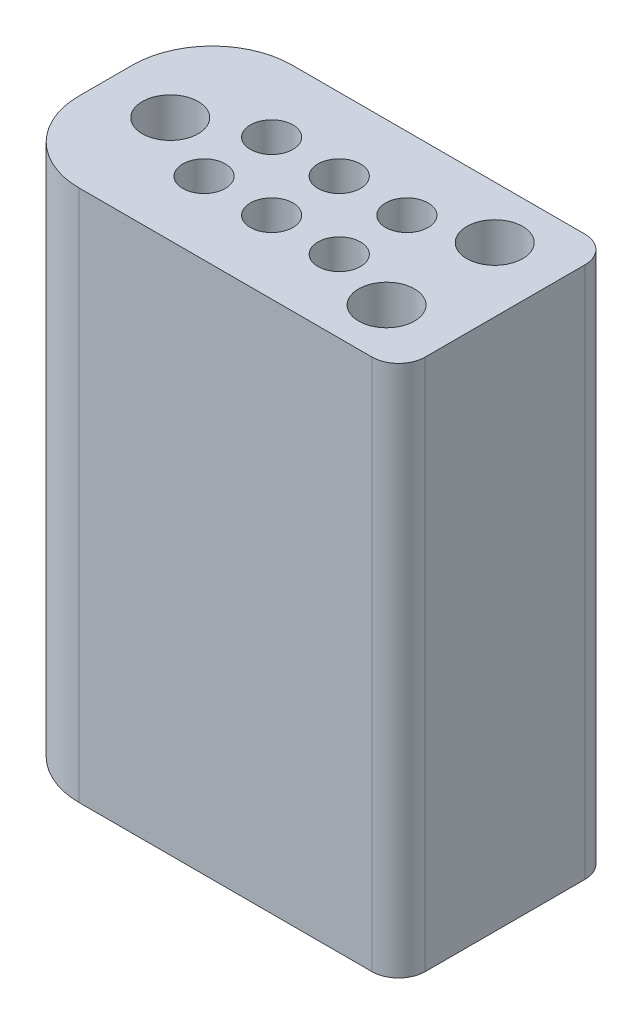
ISO-10303-21;
HEADER;
FILE_DESCRIPTION(('STEP AP214'),'2;1');
FILE_NAME('part.step','',(''),(''),'','','');
FILE_SCHEMA(('AUTOMOTIVE_DESIGN { 1 0 10303 214 1 1 1 1 }'));
ENDSEC;
DATA;
#1=APPLICATION_CONTEXT('core data for automotive mechanical design processes');
#2=APPLICATION_PROTOCOL_DEFINITION('international standard','automotive_design',2000,#1);
#3=PRODUCT_CONTEXT('',#1,'mechanical');
#4=PRODUCT('Part','Part','',(#3));
#5=PRODUCT_RELATED_PRODUCT_CATEGORY('part','',(#4));
#6=PRODUCT_DEFINITION_FORMATION('','',#4);
#7=PRODUCT_DEFINITION_CONTEXT('part definition',#1,'design');
#8=PRODUCT_DEFINITION('design','',#6,#7);
#9=PRODUCT_DEFINITION_SHAPE('','',#8);
#10=(LENGTH_UNIT() NAMED_UNIT(*) SI_UNIT(.MILLI.,.METRE.));
#11=(NAMED_UNIT(*) PLANE_ANGLE_UNIT() SI_UNIT($,.RADIAN.));
#12=(NAMED_UNIT(*) SI_UNIT($,.STERADIAN.) SOLID_ANGLE_UNIT());
#13=UNCERTAINTY_MEASURE_WITH_UNIT(LENGTH_MEASURE(1.E-05),#10,'distance_accuracy_value','');
#14=(GEOMETRIC_REPRESENTATION_CONTEXT(3) GLOBAL_UNCERTAINTY_ASSIGNED_CONTEXT((#13)) GLOBAL_UNIT_ASSIGNED_CONTEXT((#10,
#11,#12)) REPRESENTATION_CONTEXT('',''));
#15=CARTESIAN_POINT('',(0.,0.,0.));
#16=DIRECTION('',(0.,0.,1.));
#17=DIRECTION('',(1.,0.,0.));
#18=AXIS2_PLACEMENT_3D('',#15,#16,#17);
#19=CARTESIAN_POINT('',(-2.25,10.,0.5));
#20=DIRECTION('',(0.,1.,0.));
#21=DIRECTION('',(0.,0.,1.));
#22=AXIS2_PLACEMENT_3D('',#19,#20,#21);
#23=PLANE('',#22);
#24=CARTESIAN_POINT('',(2.54,10.,1.016));
#25=DIRECTION('',(0.,1.,0.));
#26=DIRECTION('',(0.,0.,1.));
#27=AXIS2_PLACEMENT_3D('',#24,#25,#26);
#28=CIRCLE('',#27,0.525);
#29=CARTESIAN_POINT('',(2.54,10.,1.541));
#30=VERTEX_POINT('',#29);
#31=EDGE_CURVE('E218',#30,#30,#28,.T.);
#32=ORIENTED_EDGE('',*,*,#31,.F.);
#33=EDGE_LOOP('',(#32));
#34=FACE_BOUND('',#33,.T.);
#35=CARTESIAN_POINT('',(1.27,10.,0.635));
#36=DIRECTION('',(0.,1.,0.));
#37=DIRECTION('',(0.,0.,1.));
#38=AXIS2_PLACEMENT_3D('',#35,#36,#37);
#39=CIRCLE('',#38,0.4);
#40=CARTESIAN_POINT('',(1.27,10.,1.035));
#41=VERTEX_POINT('',#40);
#42=EDGE_CURVE('E206',#41,#41,#39,.T.);
#43=ORIENTED_EDGE('',*,*,#42,.F.);
#44=EDGE_LOOP('',(#43));
#45=FACE_BOUND('',#44,.T.);
#46=CARTESIAN_POINT('',(-1.27,10.,-0.635));
#47=DIRECTION('',(0.,1.,0.));
#48=DIRECTION('',(0.,0.,1.));
#49=AXIS2_PLACEMENT_3D('',#46,#47,#48);
#50=CIRCLE('',#49,0.4);
#51=CARTESIAN_POINT('',(-1.27,10.,-0.235));
#52=VERTEX_POINT('',#51);
#53=EDGE_CURVE('E194',#52,#52,#50,.T.);
#54=ORIENTED_EDGE('',*,*,#53,.F.);
#55=EDGE_LOOP('',(#54));
#56=FACE_BOUND('',#55,.T.);
#57=CARTESIAN_POINT('',(0.,10.,0.635));
#58=DIRECTION('',(0.,1.,0.));
#59=DIRECTION('',(0.,0.,1.));
#60=AXIS2_PLACEMENT_3D('',#57,#58,#59);
#61=CIRCLE('',#60,0.4);
#62=CARTESIAN_POINT('',(0.,10.,1.035));
#63=VERTEX_POINT('',#62);
#64=EDGE_CURVE('E182',#63,#63,#61,.T.);
#65=ORIENTED_EDGE('',*,*,#64,.F.);
#66=EDGE_LOOP('',(#65));
#67=FACE_BOUND('',#66,.T.);
#68=CARTESIAN_POINT('',(-2.25,10.,0.5));
#69=DIRECTION('',(0.,1.,0.));
#70=DIRECTION('',(0.,0.,1.));
#71=AXIS2_PLACEMENT_3D('',#68,#69,#70);
#72=CIRCLE('',#71,1.5);
#73=CARTESIAN_POINT('',(-3.75,10.,0.5));
#74=VERTEX_POINT('',#73);
#75=CARTESIAN_POINT('',(-2.25,10.,2.));
#76=VERTEX_POINT('',#75);
#77=EDGE_CURVE('E145',#74,#76,#72,.T.);
#78=ORIENTED_EDGE('',*,*,#77,.T.);
#79=DIRECTION('',(1.,0.,0.));
#80=VECTOR('',#79,1.);
#81=CARTESIAN_POINT('',(-2.25,10.,2.));
#82=LINE('',#81,#80);
#83=CARTESIAN_POINT('',(3.25,10.,2.));
#84=VERTEX_POINT('',#83);
#85=EDGE_CURVE('E93',#76,#84,#82,.T.);
#86=ORIENTED_EDGE('',*,*,#85,.T.);
#87=CARTESIAN_POINT('',(3.25,10.,1.5));
#88=DIRECTION('',(0.,1.,0.));
#89=DIRECTION('',(0.,0.,1.));
#90=AXIS2_PLACEMENT_3D('',#87,#88,#89);
#91=CIRCLE('',#90,0.5);
#92=CARTESIAN_POINT('',(3.75,10.,1.5));
#93=VERTEX_POINT('',#92);
#94=EDGE_CURVE('E160',#84,#93,#91,.T.);
#95=ORIENTED_EDGE('',*,*,#94,.T.);
#96=DIRECTION('',(0.,0.,-1.));
#97=VECTOR('',#96,1.);
#98=CARTESIAN_POINT('',(3.75,10.,-1.5));
#99=LINE('',#98,#97);
#100=CARTESIAN_POINT('',(3.75,10.,-1.5));
#101=VERTEX_POINT('',#100);
#102=EDGE_CURVE('E173',#93,#101,#99,.T.);
#103=ORIENTED_EDGE('',*,*,#102,.T.);
#104=CARTESIAN_POINT('',(3.25,10.,-1.5));
#105=DIRECTION('',(0.,1.,0.));
#106=DIRECTION('',(0.,0.,-1.));
#107=AXIS2_PLACEMENT_3D('',#104,#105,#106);
#108=CIRCLE('',#107,0.5);
#109=CARTESIAN_POINT('',(3.25,10.,-2.));
#110=VERTEX_POINT('',#109);
#111=EDGE_CURVE('E112',#101,#110,#108,.T.);
#112=ORIENTED_EDGE('',*,*,#111,.T.);
#113=DIRECTION('',(-1.,0.,0.));
#114=VECTOR('',#113,1.);
#115=CARTESIAN_POINT('',(-2.25,10.,-2.));
#116=LINE('',#115,#114);
#117=CARTESIAN_POINT('',(-2.25,10.,-2.));
#118=VERTEX_POINT('',#117);
#119=EDGE_CURVE('E106',#110,#118,#116,.T.);
#120=ORIENTED_EDGE('',*,*,#119,.T.);
#121=CARTESIAN_POINT('',(-2.25,10.,-0.5));
#122=DIRECTION('',(0.,1.,0.));
#123=DIRECTION('',(0.,0.,1.));
#124=AXIS2_PLACEMENT_3D('',#121,#122,#123);
#125=CIRCLE('',#124,1.5);
#126=CARTESIAN_POINT('',(-3.75,10.,-0.5));
#127=VERTEX_POINT('',#126);
#128=EDGE_CURVE('E110',#118,#127,#125,.T.);
#129=ORIENTED_EDGE('',*,*,#128,.T.);
#130=DIRECTION('',(0.,0.,1.));
#131=VECTOR('',#130,1.);
#132=CARTESIAN_POINT('',(-3.75,10.,-0.5));
#133=LINE('',#132,#131);
#134=EDGE_CURVE('E50',#127,#74,#133,.T.);
#135=ORIENTED_EDGE('',*,*,#134,.T.);
#136=EDGE_LOOP('',(#78,#86,#95,#103,#112,#120,#129,#135));
#137=FACE_BOUND('',#136,.T.);
#138=CARTESIAN_POINT('',(0.,10.,-0.635));
#139=DIRECTION('',(0.,1.,0.));
#140=DIRECTION('',(0.,0.,1.));
#141=AXIS2_PLACEMENT_3D('',#138,#139,#140);
#142=CIRCLE('',#141,0.4);
#143=CARTESIAN_POINT('',(0.,10.,-0.235));
#144=VERTEX_POINT('',#143);
#145=EDGE_CURVE('E134',#144,#144,#142,.T.);
#146=ORIENTED_EDGE('',*,*,#145,.F.);
#147=EDGE_LOOP('',(#146));
#148=FACE_BOUND('',#147,.T.);
#149=CARTESIAN_POINT('',(-1.27,10.,0.635));
#150=DIRECTION('',(0.,1.,0.));
#151=DIRECTION('',(0.,0.,1.));
#152=AXIS2_PLACEMENT_3D('',#149,#150,#151);
#153=CIRCLE('',#152,0.4);
#154=CARTESIAN_POINT('',(-1.27,10.,1.035));
#155=VERTEX_POINT('',#154);
#156=EDGE_CURVE('E188',#155,#155,#153,.T.);
#157=ORIENTED_EDGE('',*,*,#156,.F.);
#158=EDGE_LOOP('',(#157));
#159=FACE_BOUND('',#158,.T.);
#160=CARTESIAN_POINT('',(1.27,10.,-0.635));
#161=DIRECTION('',(0.,1.,0.));
#162=DIRECTION('',(0.,0.,1.));
#163=AXIS2_PLACEMENT_3D('',#160,#161,#162);
#164=CIRCLE('',#163,0.4);
#165=CARTESIAN_POINT('',(1.27,10.,-0.235));
#166=VERTEX_POINT('',#165);
#167=EDGE_CURVE('E200',#166,#166,#164,.T.);
#168=ORIENTED_EDGE('',*,*,#167,.F.);
#169=EDGE_LOOP('',(#168));
#170=FACE_BOUND('',#169,.T.);
#171=CARTESIAN_POINT('',(2.54,10.,-1.016));
#172=DIRECTION('',(0.,1.,0.));
#173=DIRECTION('',(0.,0.,1.));
#174=AXIS2_PLACEMENT_3D('',#171,#172,#173);
#175=CIRCLE('',#174,0.525);
#176=CARTESIAN_POINT('',(2.54,10.,-0.491000000000001));
#177=VERTEX_POINT('',#176);
#178=EDGE_CURVE('E212',#177,#177,#175,.T.);
#179=ORIENTED_EDGE('',*,*,#178,.F.);
#180=EDGE_LOOP('',(#179));
#181=FACE_BOUND('',#180,.T.);
#182=CARTESIAN_POINT('',(-2.54,10.,0.));
#183=DIRECTION('',(0.,1.,0.));
#184=DIRECTION('',(0.,0.,1.));
#185=AXIS2_PLACEMENT_3D('',#182,#183,#184);
#186=CIRCLE('',#185,0.525);
#187=CARTESIAN_POINT('',(-2.54,10.,0.525));
#188=VERTEX_POINT('',#187);
#189=EDGE_CURVE('E224',#188,#188,#186,.T.);
#190=ORIENTED_EDGE('',*,*,#189,.F.);
#191=EDGE_LOOP('',(#190));
#192=FACE_BOUND('',#191,.T.);
#193=ADVANCED_FACE('F33',(#34,#45,#56,#67,#137,#148,#159,#170,#181,#192),#23,.T.);
#194=CARTESIAN_POINT('',(-2.25,0.,0.5));
#195=DIRECTION('',(0.,1.,0.));
#196=DIRECTION('',(0.,0.,1.));
#197=AXIS2_PLACEMENT_3D('',#194,#195,#196);
#198=PLANE('',#197);
#199=CARTESIAN_POINT('',(-2.25,0.,0.5));
#200=DIRECTION('',(0.,1.,0.));
#201=DIRECTION('',(0.,0.,1.));
#202=AXIS2_PLACEMENT_3D('',#199,#200,#201);
#203=CIRCLE('',#202,1.5);
#204=CARTESIAN_POINT('',(-3.75,0.,0.5));
#205=VERTEX_POINT('',#204);
#206=CARTESIAN_POINT('',(-2.25,0.,2.));
#207=VERTEX_POINT('',#206);
#208=EDGE_CURVE('E130',#205,#207,#203,.T.);
#209=ORIENTED_EDGE('',*,*,#208,.F.);
#210=DIRECTION('',(0.,0.,1.));
#211=VECTOR('',#210,1.);
#212=CARTESIAN_POINT('',(-3.75,0.,-0.5));
#213=LINE('',#212,#211);
#214=CARTESIAN_POINT('',(-3.75,0.,-0.5));
#215=VERTEX_POINT('',#214);
#216=EDGE_CURVE('E85',#215,#205,#213,.T.);
#217=ORIENTED_EDGE('',*,*,#216,.F.);
#218=CARTESIAN_POINT('',(-2.25,0.,-0.5));
#219=DIRECTION('',(0.,1.,0.));
#220=DIRECTION('',(0.,0.,1.));
#221=AXIS2_PLACEMENT_3D('',#218,#219,#220);
#222=CIRCLE('',#221,1.5);
#223=CARTESIAN_POINT('',(-2.25,0.,-2.));
#224=VERTEX_POINT('',#223);
#225=EDGE_CURVE('E79',#224,#215,#222,.T.);
#226=ORIENTED_EDGE('',*,*,#225,.F.);
#227=DIRECTION('',(-1.,0.,0.));
#228=VECTOR('',#227,1.);
#229=CARTESIAN_POINT('',(-2.25,0.,-2.));
#230=LINE('',#229,#228);
#231=CARTESIAN_POINT('',(3.25,0.,-2.));
#232=VERTEX_POINT('',#231);
#233=EDGE_CURVE('E120',#232,#224,#230,.T.);
#234=ORIENTED_EDGE('',*,*,#233,.F.);
#235=CARTESIAN_POINT('',(3.25,0.,-1.5));
#236=DIRECTION('',(0.,1.,0.));
#237=DIRECTION('',(0.,0.,-1.));
#238=AXIS2_PLACEMENT_3D('',#235,#236,#237);
#239=CIRCLE('',#238,0.5);
#240=CARTESIAN_POINT('',(3.75,0.,-1.5));
#241=VERTEX_POINT('',#240);
#242=EDGE_CURVE('E140',#241,#232,#239,.T.);
#243=ORIENTED_EDGE('',*,*,#242,.F.);
#244=DIRECTION('',(0.,0.,-1.));
#245=VECTOR('',#244,1.);
#246=CARTESIAN_POINT('',(3.75,0.,-1.5));
#247=LINE('',#246,#245);
#248=CARTESIAN_POINT('',(3.75,0.,1.5));
#249=VERTEX_POINT('',#248);
#250=EDGE_CURVE('E138',#249,#241,#247,.T.);
#251=ORIENTED_EDGE('',*,*,#250,.F.);
#252=CARTESIAN_POINT('',(3.25,0.,1.5));
#253=DIRECTION('',(0.,1.,0.));
#254=DIRECTION('',(0.,0.,1.));
#255=AXIS2_PLACEMENT_3D('',#252,#253,#254);
#256=CIRCLE('',#255,0.5);
#257=CARTESIAN_POINT('',(3.25,0.,2.));
#258=VERTEX_POINT('',#257);
#259=EDGE_CURVE('E136',#258,#249,#256,.T.);
#260=ORIENTED_EDGE('',*,*,#259,.F.);
#261=DIRECTION('',(1.,0.,0.));
#262=VECTOR('',#261,1.);
#263=CARTESIAN_POINT('',(-2.25,0.,2.));
#264=LINE('',#263,#262);
#265=EDGE_CURVE('E133',#207,#258,#264,.T.);
#266=ORIENTED_EDGE('',*,*,#265,.F.);
#267=EDGE_LOOP('',(#209,#217,#226,#234,#243,#251,#260,#266));
#268=FACE_BOUND('',#267,.T.);
#269=CARTESIAN_POINT('',(0.,0.,-0.635));
#270=DIRECTION('',(0.,1.,0.));
#271=DIRECTION('',(0.,0.,1.));
#272=AXIS2_PLACEMENT_3D('',#269,#270,#271);
#273=CIRCLE('',#272,0.4);
#274=CARTESIAN_POINT('',(0.,0.,-0.235));
#275=VERTEX_POINT('',#274);
#276=EDGE_CURVE('E179',#275,#275,#273,.T.);
#277=ORIENTED_EDGE('',*,*,#276,.T.);
#278=EDGE_LOOP('',(#277));
#279=FACE_BOUND('',#278,.T.);
#280=CARTESIAN_POINT('',(0.,0.,0.635));
#281=DIRECTION('',(0.,1.,0.));
#282=DIRECTION('',(0.,0.,1.));
#283=AXIS2_PLACEMENT_3D('',#280,#281,#282);
#284=CIRCLE('',#283,0.4);
#285=CARTESIAN_POINT('',(0.,0.,1.035));
#286=VERTEX_POINT('',#285);
#287=EDGE_CURVE('E185',#286,#286,#284,.T.);
#288=ORIENTED_EDGE('',*,*,#287,.T.);
#289=EDGE_LOOP('',(#288));
#290=FACE_BOUND('',#289,.T.);
#291=CARTESIAN_POINT('',(-1.27,0.,0.635));
#292=DIRECTION('',(0.,1.,0.));
#293=DIRECTION('',(0.,0.,1.));
#294=AXIS2_PLACEMENT_3D('',#291,#292,#293);
#295=CIRCLE('',#294,0.4);
#296=CARTESIAN_POINT('',(-1.27,0.,1.035));
#297=VERTEX_POINT('',#296);
#298=EDGE_CURVE('E191',#297,#297,#295,.T.);
#299=ORIENTED_EDGE('',*,*,#298,.T.);
#300=EDGE_LOOP('',(#299));
#301=FACE_BOUND('',#300,.T.);
#302=CARTESIAN_POINT('',(-1.27,0.,-0.635));
#303=DIRECTION('',(0.,1.,0.));
#304=DIRECTION('',(0.,0.,1.));
#305=AXIS2_PLACEMENT_3D('',#302,#303,#304);
#306=CIRCLE('',#305,0.4);
#307=CARTESIAN_POINT('',(-1.27,0.,-0.235));
#308=VERTEX_POINT('',#307);
#309=EDGE_CURVE('E197',#308,#308,#306,.T.);
#310=ORIENTED_EDGE('',*,*,#309,.T.);
#311=EDGE_LOOP('',(#310));
#312=FACE_BOUND('',#311,.T.);
#313=CARTESIAN_POINT('',(1.27,0.,-0.635));
#314=DIRECTION('',(0.,1.,0.));
#315=DIRECTION('',(0.,0.,1.));
#316=AXIS2_PLACEMENT_3D('',#313,#314,#315);
#317=CIRCLE('',#316,0.4);
#318=CARTESIAN_POINT('',(1.27,0.,-0.235));
#319=VERTEX_POINT('',#318);
#320=EDGE_CURVE('E203',#319,#319,#317,.T.);
#321=ORIENTED_EDGE('',*,*,#320,.T.);
#322=EDGE_LOOP('',(#321));
#323=FACE_BOUND('',#322,.T.);
#324=CARTESIAN_POINT('',(1.27,0.,0.635));
#325=DIRECTION('',(0.,1.,0.));
#326=DIRECTION('',(0.,0.,1.));
#327=AXIS2_PLACEMENT_3D('',#324,#325,#326);
#328=CIRCLE('',#327,0.4);
#329=CARTESIAN_POINT('',(1.27,0.,1.035));
#330=VERTEX_POINT('',#329);
#331=EDGE_CURVE('E209',#330,#330,#328,.T.);
#332=ORIENTED_EDGE('',*,*,#331,.T.);
#333=EDGE_LOOP('',(#332));
#334=FACE_BOUND('',#333,.T.);
#335=CARTESIAN_POINT('',(2.54,0.,-1.016));
#336=DIRECTION('',(0.,1.,0.));
#337=DIRECTION('',(0.,0.,1.));
#338=AXIS2_PLACEMENT_3D('',#335,#336,#337);
#339=CIRCLE('',#338,0.525);
#340=CARTESIAN_POINT('',(2.54,0.,-0.491000000000001));
#341=VERTEX_POINT('',#340);
#342=EDGE_CURVE('E215',#341,#341,#339,.T.);
#343=ORIENTED_EDGE('',*,*,#342,.T.);
#344=EDGE_LOOP('',(#343));
#345=FACE_BOUND('',#344,.T.);
#346=CARTESIAN_POINT('',(2.54,0.,1.016));
#347=DIRECTION('',(0.,1.,0.));
#348=DIRECTION('',(0.,0.,1.));
#349=AXIS2_PLACEMENT_3D('',#346,#347,#348);
#350=CIRCLE('',#349,0.525);
#351=CARTESIAN_POINT('',(2.54,0.,1.541));
#352=VERTEX_POINT('',#351);
#353=EDGE_CURVE('E221',#352,#352,#350,.T.);
#354=ORIENTED_EDGE('',*,*,#353,.T.);
#355=EDGE_LOOP('',(#354));
#356=FACE_BOUND('',#355,.T.);
#357=CARTESIAN_POINT('',(-2.54,0.,0.));
#358=DIRECTION('',(0.,1.,0.));
#359=DIRECTION('',(0.,0.,1.));
#360=AXIS2_PLACEMENT_3D('',#357,#358,#359);
#361=CIRCLE('',#360,0.525);
#362=CARTESIAN_POINT('',(-2.54,0.,0.525));
#363=VERTEX_POINT('',#362);
#364=EDGE_CURVE('E227',#363,#363,#361,.T.);
#365=ORIENTED_EDGE('',*,*,#364,.T.);
#366=EDGE_LOOP('',(#365));
#367=FACE_BOUND('',#366,.T.);
#368=ADVANCED_FACE('F164',(#268,#279,#290,#301,#312,#323,#334,#345,#356,#367),#198,.F.);
#369=CARTESIAN_POINT('',(-2.25,10.,0.5));
#370=DIRECTION('',(0.,-1.,0.));
#371=DIRECTION('',(0.,0.,-1.));
#372=AXIS2_PLACEMENT_3D('',#369,#370,#371);
#373=CYLINDRICAL_SURFACE('',#372,1.5);
#374=ORIENTED_EDGE('',*,*,#208,.T.);
#375=DIRECTION('',(0.,-1.,0.));
#376=VECTOR('',#375,1.);
#377=CARTESIAN_POINT('',(-2.25,10.,2.));
#378=LINE('',#377,#376);
#379=EDGE_CURVE('E11',#76,#207,#378,.T.);
#380=ORIENTED_EDGE('',*,*,#379,.F.);
#381=ORIENTED_EDGE('',*,*,#77,.F.);
#382=DIRECTION('',(0.,-1.,0.));
#383=VECTOR('',#382,1.);
#384=CARTESIAN_POINT('',(-3.75,10.,0.5));
#385=LINE('',#384,#383);
#386=EDGE_CURVE('E126',#74,#205,#385,.T.);
#387=ORIENTED_EDGE('',*,*,#386,.T.);
#388=EDGE_LOOP('',(#374,#380,#381,#387));
#389=FACE_BOUND('',#388,.T.);
#390=ADVANCED_FACE('F35',(#389),#373,.T.);
#391=CARTESIAN_POINT('',(-2.25,10.,2.));
#392=DIRECTION('',(0.,0.,-1.));
#393=DIRECTION('',(-1.,0.,0.));
#394=AXIS2_PLACEMENT_3D('',#391,#392,#393);
#395=PLANE('',#394);
#396=ORIENTED_EDGE('',*,*,#265,.T.);
#397=DIRECTION('',(0.,-1.,0.));
#398=VECTOR('',#397,1.);
#399=CARTESIAN_POINT('',(3.25,10.,2.));
#400=LINE('',#399,#398);
#401=EDGE_CURVE('E42',#84,#258,#400,.T.);
#402=ORIENTED_EDGE('',*,*,#401,.F.);
#403=ORIENTED_EDGE('',*,*,#85,.F.);
#404=ORIENTED_EDGE('',*,*,#379,.T.);
#405=EDGE_LOOP('',(#396,#402,#403,#404));
#406=FACE_BOUND('',#405,.T.);
#407=ADVANCED_FACE('F261',(#406),#395,.F.);
#408=CARTESIAN_POINT('',(3.25,10.,1.5));
#409=DIRECTION('',(0.,-1.,0.));
#410=DIRECTION('',(0.,0.,-1.));
#411=AXIS2_PLACEMENT_3D('',#408,#409,#410);
#412=CYLINDRICAL_SURFACE('',#411,0.5);
#413=ORIENTED_EDGE('',*,*,#259,.T.);
#414=DIRECTION('',(0.,-1.,0.));
#415=VECTOR('',#414,1.);
#416=CARTESIAN_POINT('',(3.75,10.,1.5));
#417=LINE('',#416,#415);
#418=EDGE_CURVE('E152',#93,#249,#417,.T.);
#419=ORIENTED_EDGE('',*,*,#418,.F.);
#420=ORIENTED_EDGE('',*,*,#94,.F.);
#421=ORIENTED_EDGE('',*,*,#401,.T.);
#422=EDGE_LOOP('',(#413,#419,#420,#421));
#423=FACE_BOUND('',#422,.T.);
#424=ADVANCED_FACE('F158',(#423),#412,.T.);
#425=CARTESIAN_POINT('',(3.75,10.,-1.5));
#426=DIRECTION('',(-1.,0.,0.));
#427=DIRECTION('',(0.,0.,1.));
#428=AXIS2_PLACEMENT_3D('',#425,#426,#427);
#429=PLANE('',#428);
#430=ORIENTED_EDGE('',*,*,#250,.T.);
#431=DIRECTION('',(0.,-1.,0.));
#432=VECTOR('',#431,1.);
#433=CARTESIAN_POINT('',(3.75,10.,-1.5));
#434=LINE('',#433,#432);
#435=EDGE_CURVE('E149',#101,#241,#434,.T.);
#436=ORIENTED_EDGE('',*,*,#435,.F.);
#437=ORIENTED_EDGE('',*,*,#102,.F.);
#438=ORIENTED_EDGE('',*,*,#418,.T.);
#439=EDGE_LOOP('',(#430,#436,#437,#438));
#440=FACE_BOUND('',#439,.T.);
#441=ADVANCED_FACE('F169',(#440),#429,.F.);
#442=CARTESIAN_POINT('',(3.25,10.,-1.5));
#443=DIRECTION('',(0.,-1.,0.));
#444=DIRECTION('',(0.,0.,-1.));
#445=AXIS2_PLACEMENT_3D('',#442,#443,#444);
#446=CYLINDRICAL_SURFACE('',#445,0.5);
#447=ORIENTED_EDGE('',*,*,#242,.T.);
#448=DIRECTION('',(0.,-1.,0.));
#449=VECTOR('',#448,1.);
#450=CARTESIAN_POINT('',(3.25,10.,-2.));
#451=LINE('',#450,#449);
#452=EDGE_CURVE('E121',#110,#232,#451,.T.);
#453=ORIENTED_EDGE('',*,*,#452,.F.);
#454=ORIENTED_EDGE('',*,*,#111,.F.);
#455=ORIENTED_EDGE('',*,*,#435,.T.);
#456=EDGE_LOOP('',(#447,#453,#454,#455));
#457=FACE_BOUND('',#456,.T.);
#458=ADVANCED_FACE('F172',(#457),#446,.T.);
#459=CARTESIAN_POINT('',(-2.25,10.,-2.));
#460=DIRECTION('',(0.,0.,1.));
#461=DIRECTION('',(1.,0.,0.));
#462=AXIS2_PLACEMENT_3D('',#459,#460,#461);
#463=PLANE('',#462);
#464=ORIENTED_EDGE('',*,*,#233,.T.);
#465=DIRECTION('',(0.,-1.,0.));
#466=VECTOR('',#465,1.);
#467=CARTESIAN_POINT('',(-2.25,10.,-2.));
#468=LINE('',#467,#466);
#469=EDGE_CURVE('E117',#118,#224,#468,.T.);
#470=ORIENTED_EDGE('',*,*,#469,.F.);
#471=ORIENTED_EDGE('',*,*,#119,.F.);
#472=ORIENTED_EDGE('',*,*,#452,.T.);
#473=EDGE_LOOP('',(#464,#470,#471,#472));
#474=FACE_BOUND('',#473,.T.);
#475=ADVANCED_FACE('F118',(#474),#463,.F.);
#476=CARTESIAN_POINT('',(-2.25,10.,-0.5));
#477=DIRECTION('',(0.,-1.,0.));
#478=DIRECTION('',(0.,0.,-1.));
#479=AXIS2_PLACEMENT_3D('',#476,#477,#478);
#480=CYLINDRICAL_SURFACE('',#479,1.5);
#481=ORIENTED_EDGE('',*,*,#225,.T.);
#482=DIRECTION('',(0.,-1.,0.));
#483=VECTOR('',#482,1.);
#484=CARTESIAN_POINT('',(-3.75,10.,-0.5));
#485=LINE('',#484,#483);
#486=EDGE_CURVE('E122',#127,#215,#485,.T.);
#487=ORIENTED_EDGE('',*,*,#486,.F.);
#488=ORIENTED_EDGE('',*,*,#128,.F.);
#489=ORIENTED_EDGE('',*,*,#469,.T.);
#490=EDGE_LOOP('',(#481,#487,#488,#489));
#491=FACE_BOUND('',#490,.T.);
#492=ADVANCED_FACE('F124',(#491),#480,.T.);
#493=CARTESIAN_POINT('',(-3.75,10.,-0.5));
#494=DIRECTION('',(1.,0.,0.));
#495=DIRECTION('',(0.,0.,-1.));
#496=AXIS2_PLACEMENT_3D('',#493,#494,#495);
#497=PLANE('',#496);
#498=ORIENTED_EDGE('',*,*,#216,.T.);
#499=ORIENTED_EDGE('',*,*,#386,.F.);
#500=ORIENTED_EDGE('',*,*,#134,.F.);
#501=ORIENTED_EDGE('',*,*,#486,.T.);
#502=EDGE_LOOP('',(#498,#499,#500,#501));
#503=FACE_BOUND('',#502,.T.);
#504=ADVANCED_FACE('F249',(#503),#497,.F.);
#505=CARTESIAN_POINT('',(0.,10.,-0.635));
#506=DIRECTION('',(0.,-1.,0.));
#507=DIRECTION('',(0.,0.,-1.));
#508=AXIS2_PLACEMENT_3D('',#505,#506,#507);
#509=CYLINDRICAL_SURFACE('',#508,0.4);
#510=ORIENTED_EDGE('',*,*,#145,.T.);
#511=EDGE_LOOP('',(#510));
#512=FACE_BOUND('',#511,.T.);
#513=ORIENTED_EDGE('',*,*,#276,.F.);
#514=EDGE_LOOP('',(#513));
#515=FACE_BOUND('',#514,.T.);
#516=ADVANCED_FACE('F246',(#512,#515),#509,.F.);
#517=CARTESIAN_POINT('',(0.,10.,0.635));
#518=DIRECTION('',(0.,-1.,0.));
#519=DIRECTION('',(0.,0.,-1.));
#520=AXIS2_PLACEMENT_3D('',#517,#518,#519);
#521=CYLINDRICAL_SURFACE('',#520,0.4);
#522=ORIENTED_EDGE('',*,*,#64,.T.);
#523=EDGE_LOOP('',(#522));
#524=FACE_BOUND('',#523,.T.);
#525=ORIENTED_EDGE('',*,*,#287,.F.);
#526=EDGE_LOOP('',(#525));
#527=FACE_BOUND('',#526,.T.);
#528=ADVANCED_FACE('F325',(#524,#527),#521,.F.);
#529=CARTESIAN_POINT('',(-1.27,10.,0.635));
#530=DIRECTION('',(0.,-1.,0.));
#531=DIRECTION('',(0.,0.,-1.));
#532=AXIS2_PLACEMENT_3D('',#529,#530,#531);
#533=CYLINDRICAL_SURFACE('',#532,0.4);
#534=ORIENTED_EDGE('',*,*,#156,.T.);
#535=EDGE_LOOP('',(#534));
#536=FACE_BOUND('',#535,.T.);
#537=ORIENTED_EDGE('',*,*,#298,.F.);
#538=EDGE_LOOP('',(#537));
#539=FACE_BOUND('',#538,.T.);
#540=ADVANCED_FACE('F333',(#536,#539),#533,.F.);
#541=CARTESIAN_POINT('',(-1.27,10.,-0.635));
#542=DIRECTION('',(0.,-1.,0.));
#543=DIRECTION('',(0.,0.,-1.));
#544=AXIS2_PLACEMENT_3D('',#541,#542,#543);
#545=CYLINDRICAL_SURFACE('',#544,0.4);
#546=ORIENTED_EDGE('',*,*,#53,.T.);
#547=EDGE_LOOP('',(#546));
#548=FACE_BOUND('',#547,.T.);
#549=ORIENTED_EDGE('',*,*,#309,.F.);
#550=EDGE_LOOP('',(#549));
#551=FACE_BOUND('',#550,.T.);
#552=ADVANCED_FACE('F341',(#548,#551),#545,.F.);
#553=CARTESIAN_POINT('',(1.27,10.,-0.635));
#554=DIRECTION('',(0.,-1.,0.));
#555=DIRECTION('',(0.,0.,-1.));
#556=AXIS2_PLACEMENT_3D('',#553,#554,#555);
#557=CYLINDRICAL_SURFACE('',#556,0.4);
#558=ORIENTED_EDGE('',*,*,#167,.T.);
#559=EDGE_LOOP('',(#558));
#560=FACE_BOUND('',#559,.T.);
#561=ORIENTED_EDGE('',*,*,#320,.F.);
#562=EDGE_LOOP('',(#561));
#563=FACE_BOUND('',#562,.T.);
#564=ADVANCED_FACE('F350',(#560,#563),#557,.F.);
#565=CARTESIAN_POINT('',(1.27,10.,0.635));
#566=DIRECTION('',(0.,-1.,0.));
#567=DIRECTION('',(0.,0.,-1.));
#568=AXIS2_PLACEMENT_3D('',#565,#566,#567);
#569=CYLINDRICAL_SURFACE('',#568,0.4);
#570=ORIENTED_EDGE('',*,*,#42,.T.);
#571=EDGE_LOOP('',(#570));
#572=FACE_BOUND('',#571,.T.);
#573=ORIENTED_EDGE('',*,*,#331,.F.);
#574=EDGE_LOOP('',(#573));
#575=FACE_BOUND('',#574,.T.);
#576=ADVANCED_FACE('F359',(#572,#575),#569,.F.);
#577=CARTESIAN_POINT('',(2.54,10.,-1.016));
#578=DIRECTION('',(0.,-1.,0.));
#579=DIRECTION('',(0.,0.,-1.));
#580=AXIS2_PLACEMENT_3D('',#577,#578,#579);
#581=CYLINDRICAL_SURFACE('',#580,0.525);
#582=ORIENTED_EDGE('',*,*,#178,.T.);
#583=EDGE_LOOP('',(#582));
#584=FACE_BOUND('',#583,.T.);
#585=ORIENTED_EDGE('',*,*,#342,.F.);
#586=EDGE_LOOP('',(#585));
#587=FACE_BOUND('',#586,.T.);
#588=ADVANCED_FACE('F368',(#584,#587),#581,.F.);
#589=CARTESIAN_POINT('',(2.54,10.,1.016));
#590=DIRECTION('',(0.,-1.,0.));
#591=DIRECTION('',(0.,0.,-1.));
#592=AXIS2_PLACEMENT_3D('',#589,#590,#591);
#593=CYLINDRICAL_SURFACE('',#592,0.525);
#594=ORIENTED_EDGE('',*,*,#31,.T.);
#595=EDGE_LOOP('',(#594));
#596=FACE_BOUND('',#595,.T.);
#597=ORIENTED_EDGE('',*,*,#353,.F.);
#598=EDGE_LOOP('',(#597));
#599=FACE_BOUND('',#598,.T.);
#600=ADVANCED_FACE('F377',(#596,#599),#593,.F.);
#601=CARTESIAN_POINT('',(-2.54,10.,0.));
#602=DIRECTION('',(0.,-1.,0.));
#603=DIRECTION('',(0.,0.,-1.));
#604=AXIS2_PLACEMENT_3D('',#601,#602,#603);
#605=CYLINDRICAL_SURFACE('',#604,0.525);
#606=ORIENTED_EDGE('',*,*,#189,.T.);
#607=EDGE_LOOP('',(#606));
#608=FACE_BOUND('',#607,.T.);
#609=ORIENTED_EDGE('',*,*,#364,.F.);
#610=EDGE_LOOP('',(#609));
#611=FACE_BOUND('',#610,.T.);
#612=ADVANCED_FACE('F233',(#608,#611),#605,.F.);
#613=CLOSED_SHELL('',(#193,#368,#390,#407,#424,#441,#458,#475,#492,#504,#516,#528,#540,#552,
#564,#576,#588,#600,#612));
#614=MANIFOLD_SOLID_BREP('B2',#613);
#615=ADVANCED_BREP_SHAPE_REPRESENTATION('',(#18,#614),#14);
#616=SHAPE_DEFINITION_REPRESENTATION(#9,#615);
ENDSEC;
END-ISO-10303-21;
